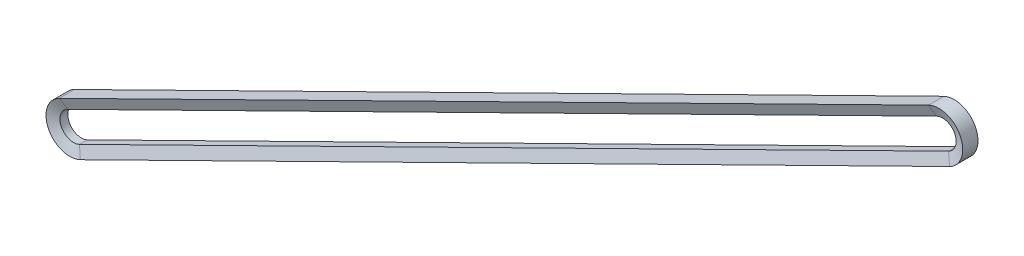
ISO-10303-21;
HEADER;
FILE_DESCRIPTION(('STEP AP214'),'2;1');
FILE_NAME('part.step','',(''),(''),'','','');
FILE_SCHEMA(('AUTOMOTIVE_DESIGN { 1 0 10303 214 1 1 1 1 }'));
ENDSEC;
DATA;
#1=APPLICATION_CONTEXT('core data for automotive mechanical design processes');
#2=APPLICATION_PROTOCOL_DEFINITION('international standard','automotive_design',2000,#1);
#3=PRODUCT_CONTEXT('',#1,'mechanical');
#4=PRODUCT('Part','Part','',(#3));
#5=PRODUCT_RELATED_PRODUCT_CATEGORY('part','',(#4));
#6=PRODUCT_DEFINITION_FORMATION('','',#4);
#7=PRODUCT_DEFINITION_CONTEXT('part definition',#1,'design');
#8=PRODUCT_DEFINITION('design','',#6,#7);
#9=PRODUCT_DEFINITION_SHAPE('','',#8);
#10=(LENGTH_UNIT() NAMED_UNIT(*) SI_UNIT(.MILLI.,.METRE.));
#11=(NAMED_UNIT(*) PLANE_ANGLE_UNIT() SI_UNIT($,.RADIAN.));
#12=(NAMED_UNIT(*) SI_UNIT($,.STERADIAN.) SOLID_ANGLE_UNIT());
#13=UNCERTAINTY_MEASURE_WITH_UNIT(LENGTH_MEASURE(1.E-05),#10,'distance_accuracy_value','');
#14=(GEOMETRIC_REPRESENTATION_CONTEXT(3) GLOBAL_UNCERTAINTY_ASSIGNED_CONTEXT((#13)) GLOBAL_UNIT_ASSIGNED_CONTEXT((#10,
#11,#12)) REPRESENTATION_CONTEXT('',''));
#15=CARTESIAN_POINT('',(0.,0.,0.));
#16=DIRECTION('',(0.,0.,1.));
#17=DIRECTION('',(1.,0.,0.));
#18=AXIS2_PLACEMENT_3D('',#15,#16,#17);
#19=CARTESIAN_POINT('',(-2.22044604925031E-13,-3.33066907387547E-13,0.));
#20=DIRECTION('',(0.,0.,1.));
#21=DIRECTION('',(1.,0.,0.));
#22=AXIS2_PLACEMENT_3D('',#19,#20,#21);
#23=CYLINDRICAL_SURFACE('',#22,5.29999999999982);
#24=CARTESIAN_POINT('',(-2.22044604925031E-13,-3.33066907387547E-13,-1.535));
#25=DIRECTION('',(0.,0.,1.));
#26=DIRECTION('',(0.442324592711042,-0.896855035489577,0.));
#27=AXIS2_PLACEMENT_3D('',#24,#25,#26);
#28=CIRCLE('',#27,5.29999999999982);
#29=CARTESIAN_POINT('',(2.34432034136839,-4.75333168809533,-1.535));
#30=VERTEX_POINT('',#29);
#31=CARTESIAN_POINT('',(-2.34432034136822,4.75333168809494,-1.535));
#32=VERTEX_POINT('',#31);
#33=EDGE_CURVE('E11',#30,#32,#28,.T.);
#34=ORIENTED_EDGE('',*,*,#33,.F.);
#35=DIRECTION('',(0.,0.,-1.));
#36=VECTOR('',#35,1.);
#37=CARTESIAN_POINT('',(2.34432034136822,-4.75333168809494,1.535));
#38=LINE('',#37,#36);
#39=CARTESIAN_POINT('',(2.34432034136839,-4.75333168809533,1.535));
#40=VERTEX_POINT('',#39);
#41=EDGE_CURVE('E42',#30,#40,#38,.F.);
#42=ORIENTED_EDGE('',*,*,#41,.T.);
#43=CARTESIAN_POINT('',(-2.22044604925031E-13,-3.33066907387547E-13,1.535));
#44=DIRECTION('',(0.,0.,1.));
#45=DIRECTION('',(0.442324592711042,-0.896855035489577,0.));
#46=AXIS2_PLACEMENT_3D('',#43,#44,#45);
#47=CIRCLE('',#46,5.29999999999982);
#48=CARTESIAN_POINT('',(-2.34432034136822,4.75333168809494,1.535));
#49=VERTEX_POINT('',#48);
#50=EDGE_CURVE('E127',#40,#49,#47,.T.);
#51=ORIENTED_EDGE('',*,*,#50,.T.);
#52=DIRECTION('',(0.,0.,-1.));
#53=VECTOR('',#52,1.);
#54=CARTESIAN_POINT('',(-2.34432034136822,4.75333168809494,1.535));
#55=LINE('',#54,#53);
#56=EDGE_CURVE('E130',#32,#49,#55,.F.);
#57=ORIENTED_EDGE('',*,*,#56,.F.);
#58=EDGE_LOOP('',(#34,#42,#51,#57));
#59=FACE_BOUND('',#58,.T.);
#60=ADVANCED_FACE('F39',(#59),#23,.F.);
#61=CARTESIAN_POINT('',(-2.22044604925031E-13,-3.33066907387547E-13,-2.99088093706479));
#62=DIRECTION('',(0.,0.,-1.));
#63=DIRECTION('',(-1.,0.,0.));
#64=AXIS2_PLACEMENT_3D('',#61,#62,#63);
#65=CONICAL_SURFACE('',#64,9.29999999999982,1.22173047639603);
#66=CARTESIAN_POINT('',(-2.22044604925031E-13,-3.33066907387547E-13,-2.99088093706479));
#67=DIRECTION('',(0.,0.,1.));
#68=DIRECTION('',(0.442324592711016,-0.89685503548959,0.));
#69=AXIS2_PLACEMENT_3D('',#66,#67,#68);
#70=CIRCLE('',#69,9.29999999999982);
#71=CARTESIAN_POINT('',(4.11361871221233,-8.34075183005375,-2.99088093706479));
#72=VERTEX_POINT('',#71);
#73=CARTESIAN_POINT('',(-4.11361871221215,8.34075183005336,-2.99088093706479));
#74=VERTEX_POINT('',#73);
#75=EDGE_CURVE('E47',#72,#74,#70,.T.);
#76=ORIENTED_EDGE('',*,*,#75,.F.);
#77=DIRECTION('',(0.415649155762644,-0.842768058764268,-0.342020143325666));
#78=VECTOR('',#77,1.);
#79=CARTESIAN_POINT('',(2.34432034136822,-4.75333168809494,-1.535));
#80=LINE('',#79,#78);
#81=EDGE_CURVE('E197',#72,#30,#80,.F.);
#82=ORIENTED_EDGE('',*,*,#81,.T.);
#83=ORIENTED_EDGE('',*,*,#33,.T.);
#84=DIRECTION('',(-0.415649155762644,0.842768058764268,-0.342020143325666));
#85=VECTOR('',#84,1.);
#86=CARTESIAN_POINT('',(-2.34432034136822,4.75333168809494,-1.535));
#87=LINE('',#86,#85);
#88=EDGE_CURVE('E155',#74,#32,#87,.F.);
#89=ORIENTED_EDGE('',*,*,#88,.F.);
#90=EDGE_LOOP('',(#76,#82,#83,#89));
#91=FACE_BOUND('',#90,.T.);
#92=ADVANCED_FACE('F221',(#91),#65,.F.);
#93=CARTESIAN_POINT('',(-2.22044604925031E-13,-3.33066907387547E-13,0.));
#94=DIRECTION('',(0.,0.,1.));
#95=DIRECTION('',(1.,0.,0.));
#96=AXIS2_PLACEMENT_3D('',#93,#94,#95);
#97=CYLINDRICAL_SURFACE('',#96,9.29999999999982);
#98=CARTESIAN_POINT('',(-2.22044604925031E-13,-3.33066907387547E-13,2.99088093706479));
#99=DIRECTION('',(0.,0.,1.));
#100=DIRECTION('',(0.442324592711016,-0.89685503548959,0.));
#101=AXIS2_PLACEMENT_3D('',#98,#99,#100);
#102=CIRCLE('',#101,9.29999999999982);
#103=CARTESIAN_POINT('',(4.11361871221233,-8.34075183005375,2.99088093706479));
#104=VERTEX_POINT('',#103);
#105=CARTESIAN_POINT('',(-4.11361871221215,8.34075183005336,2.99088093706479));
#106=VERTEX_POINT('',#105);
#107=EDGE_CURVE('E136',#104,#106,#102,.T.);
#108=ORIENTED_EDGE('',*,*,#107,.F.);
#109=DIRECTION('',(0.,0.,-1.));
#110=VECTOR('',#109,1.);
#111=CARTESIAN_POINT('',(4.11361871221215,-8.34075183005336,2.99088093706479));
#112=LINE('',#111,#110);
#113=EDGE_CURVE('E181',#104,#72,#112,.T.);
#114=ORIENTED_EDGE('',*,*,#113,.T.);
#115=ORIENTED_EDGE('',*,*,#75,.T.);
#116=DIRECTION('',(0.,0.,-1.));
#117=VECTOR('',#116,1.);
#118=CARTESIAN_POINT('',(-4.11361871221215,8.34075183005336,2.99088093706479));
#119=LINE('',#118,#117);
#120=EDGE_CURVE('E159',#106,#74,#119,.T.);
#121=ORIENTED_EDGE('',*,*,#120,.F.);
#122=EDGE_LOOP('',(#108,#114,#115,#121));
#123=FACE_BOUND('',#122,.T.);
#124=ADVANCED_FACE('F226',(#123),#97,.T.);
#125=CARTESIAN_POINT('',(-337.429166382249,-172.327982196657,1.535));
#126=DIRECTION('',(-0.442324592710983,0.896855035489606,0.));
#127=DIRECTION('',(-0.896855035489607,-0.442324592710983,0.));
#128=AXIS2_PLACEMENT_3D('',#125,#126,#127);
#129=PLANE('',#128);
#130=ORIENTED_EDGE('',*,*,#41,.F.);
#131=DIRECTION('',(0.896855035489606,0.442324592710983,0.));
#132=VECTOR('',#131,1.);
#133=CARTESIAN_POINT('',(-337.429166382249,-172.327982196657,-1.535));
#134=LINE('',#133,#132);
#135=CARTESIAN_POINT('',(-337.429166382249,-172.327982196657,-1.535));
#136=VERTEX_POINT('',#135);
#137=EDGE_CURVE('E83',#136,#30,#134,.T.);
#138=ORIENTED_EDGE('',*,*,#137,.F.);
#139=DIRECTION('',(0.,0.,-1.));
#140=VECTOR('',#139,1.);
#141=CARTESIAN_POINT('',(-337.429166382249,-172.327982196657,1.535));
#142=LINE('',#141,#140);
#143=CARTESIAN_POINT('',(-337.429166382249,-172.327982196657,1.535));
#144=VERTEX_POINT('',#143);
#145=EDGE_CURVE('E184',#136,#144,#142,.F.);
#146=ORIENTED_EDGE('',*,*,#145,.T.);
#147=DIRECTION('',(0.896855035489606,0.442324592710983,0.));
#148=VECTOR('',#147,1.);
#149=CARTESIAN_POINT('',(-337.429166382249,-172.327982196657,1.535));
#150=LINE('',#149,#148);
#151=EDGE_CURVE('E179',#144,#40,#150,.T.);
#152=ORIENTED_EDGE('',*,*,#151,.T.);
#153=EDGE_LOOP('',(#130,#138,#146,#152));
#154=FACE_BOUND('',#153,.T.);
#155=ADVANCED_FACE('F210',(#154),#129,.T.);
#156=CARTESIAN_POINT('',(-337.429166382249,-172.327982196657,-1.535));
#157=DIRECTION('',(-0.151283920595477,0.3067424877805,-0.93969262078591));
#158=DIRECTION('',(0.,0.950634084780424,0.310314093868916));
#159=AXIS2_PLACEMENT_3D('',#156,#157,#158);
#160=PLANE('',#159);
#161=ORIENTED_EDGE('',*,*,#137,.T.);
#162=ORIENTED_EDGE('',*,*,#81,.F.);
#163=DIRECTION('',(0.896855035489606,0.442324592710983,0.));
#164=VECTOR('',#163,1.);
#165=CARTESIAN_POINT('',(-335.659868011405,-175.915402338615,-2.99088093706479));
#166=LINE('',#165,#164);
#167=CARTESIAN_POINT('',(-335.659868011405,-175.915402338615,-2.99088093706479));
#168=VERTEX_POINT('',#167);
#169=EDGE_CURVE('E92',#168,#72,#166,.T.);
#170=ORIENTED_EDGE('',*,*,#169,.F.);
#171=DIRECTION('',(0.415649155762645,-0.842768058764267,-0.342020143325666));
#172=VECTOR('',#171,1.);
#173=CARTESIAN_POINT('',(-337.429166382249,-172.327982196657,-1.535));
#174=LINE('',#173,#172);
#175=EDGE_CURVE('E193',#168,#136,#174,.F.);
#176=ORIENTED_EDGE('',*,*,#175,.T.);
#177=EDGE_LOOP('',(#161,#162,#170,#176));
#178=FACE_BOUND('',#177,.T.);
#179=ADVANCED_FACE('F220',(#178),#160,.T.);
#180=CARTESIAN_POINT('',(-335.659868011405,-175.915402338615,2.99088093706479));
#181=DIRECTION('',(0.442324592710983,-0.896855035489606,0.));
#182=DIRECTION('',(0.896855035489607,0.442324592710983,0.));
#183=AXIS2_PLACEMENT_3D('',#180,#181,#182);
#184=PLANE('',#183);
#185=ORIENTED_EDGE('',*,*,#169,.T.);
#186=ORIENTED_EDGE('',*,*,#113,.F.);
#187=DIRECTION('',(0.896855035489606,0.442324592710983,0.));
#188=VECTOR('',#187,1.);
#189=CARTESIAN_POINT('',(-335.659868011405,-175.915402338615,2.99088093706479));
#190=LINE('',#189,#188);
#191=CARTESIAN_POINT('',(-335.659868011405,-175.915402338615,2.99088093706479));
#192=VERTEX_POINT('',#191);
#193=EDGE_CURVE('E100',#192,#104,#190,.T.);
#194=ORIENTED_EDGE('',*,*,#193,.F.);
#195=DIRECTION('',(0.,0.,-1.));
#196=VECTOR('',#195,1.);
#197=CARTESIAN_POINT('',(-335.659868011405,-175.915402338615,2.99088093706479));
#198=LINE('',#197,#196);
#199=EDGE_CURVE('E173',#192,#168,#198,.T.);
#200=ORIENTED_EDGE('',*,*,#199,.T.);
#201=EDGE_LOOP('',(#185,#186,#194,#200));
#202=FACE_BOUND('',#201,.T.);
#203=ADVANCED_FACE('F227',(#202),#184,.T.);
#204=CARTESIAN_POINT('',(-337.429166382249,-172.327982196657,1.535));
#205=DIRECTION('',(-0.151283920595477,0.3067424877805,0.93969262078591));
#206=DIRECTION('',(0.,-0.950634084780424,0.310314093868916));
#207=AXIS2_PLACEMENT_3D('',#204,#205,#206);
#208=PLANE('',#207);
#209=ORIENTED_EDGE('',*,*,#193,.T.);
#210=DIRECTION('',(0.415649155762644,-0.842768058764268,0.342020143325666));
#211=VECTOR('',#210,1.);
#212=CARTESIAN_POINT('',(2.34432034136822,-4.75333168809494,1.535));
#213=LINE('',#212,#211);
#214=EDGE_CURVE('E177',#40,#104,#213,.T.);
#215=ORIENTED_EDGE('',*,*,#214,.F.);
#216=ORIENTED_EDGE('',*,*,#151,.F.);
#217=DIRECTION('',(0.415649155762645,-0.842768058764267,0.342020143325666));
#218=VECTOR('',#217,1.);
#219=CARTESIAN_POINT('',(-337.429166382249,-172.327982196657,1.535));
#220=LINE('',#219,#218);
#221=EDGE_CURVE('E168',#144,#192,#220,.T.);
#222=ORIENTED_EDGE('',*,*,#221,.T.);
#223=EDGE_LOOP('',(#209,#215,#216,#222));
#224=FACE_BOUND('',#223,.T.);
#225=ADVANCED_FACE('F228',(#224),#208,.T.);
#226=CARTESIAN_POINT('',(-339.773486723617,-167.574650508562,0.));
#227=DIRECTION('',(0.,0.,1.));
#228=DIRECTION('',(1.,0.,0.));
#229=AXIS2_PLACEMENT_3D('',#226,#227,#228);
#230=CYLINDRICAL_SURFACE('',#229,5.30000000000023);
#231=ORIENTED_EDGE('',*,*,#145,.F.);
#232=CARTESIAN_POINT('',(-339.773486723617,-167.574650508562,-1.535));
#233=DIRECTION('',(0.,0.,1.));
#234=DIRECTION('',(-0.442324592710914,0.896855035489641,0.));
#235=AXIS2_PLACEMENT_3D('',#232,#233,#234);
#236=CIRCLE('',#235,5.30000000000023);
#237=CARTESIAN_POINT('',(-342.117807064985,-162.821318820466,-1.535));
#238=VERTEX_POINT('',#237);
#239=EDGE_CURVE('E203',#238,#136,#236,.T.);
#240=ORIENTED_EDGE('',*,*,#239,.F.);
#241=DIRECTION('',(0.,0.,-1.));
#242=VECTOR('',#241,1.);
#243=CARTESIAN_POINT('',(-342.117807064985,-162.821318820466,1.535));
#244=LINE('',#243,#242);
#245=CARTESIAN_POINT('',(-342.117807064985,-162.821318820466,1.535));
#246=VERTEX_POINT('',#245);
#247=EDGE_CURVE('E176',#238,#246,#244,.F.);
#248=ORIENTED_EDGE('',*,*,#247,.T.);
#249=CARTESIAN_POINT('',(-339.773486723617,-167.574650508562,1.535));
#250=DIRECTION('',(0.,0.,1.));
#251=DIRECTION('',(-0.442324592710914,0.896855035489641,0.));
#252=AXIS2_PLACEMENT_3D('',#249,#250,#251);
#253=CIRCLE('',#252,5.30000000000023);
#254=EDGE_CURVE('E171',#246,#144,#253,.T.);
#255=ORIENTED_EDGE('',*,*,#254,.T.);
#256=EDGE_LOOP('',(#231,#240,#248,#255));
#257=FACE_BOUND('',#256,.T.);
#258=ADVANCED_FACE('F215',(#257),#230,.F.);
#259=CARTESIAN_POINT('',(-339.773486723617,-167.574650508562,-2.99088093706479));
#260=DIRECTION('',(0.,0.,-1.));
#261=DIRECTION('',(-1.,0.,0.));
#262=AXIS2_PLACEMENT_3D('',#259,#260,#261);
#263=CONICAL_SURFACE('',#262,9.30000000000024,1.22173047639603);
#264=ORIENTED_EDGE('',*,*,#239,.T.);
#265=ORIENTED_EDGE('',*,*,#175,.F.);
#266=CARTESIAN_POINT('',(-339.773486723617,-167.574650508562,-2.99088093706479));
#267=DIRECTION('',(0.,0.,1.));
#268=DIRECTION('',(-0.442324592710944,0.896855035489625,0.));
#269=AXIS2_PLACEMENT_3D('',#266,#267,#268);
#270=CIRCLE('',#269,9.30000000000024);
#271=CARTESIAN_POINT('',(-343.887105435828,-159.233898678508,-2.99088093706479));
#272=VERTEX_POINT('',#271);
#273=EDGE_CURVE('E112',#272,#168,#270,.T.);
#274=ORIENTED_EDGE('',*,*,#273,.F.);
#275=DIRECTION('',(-0.415649155762644,0.842768058764268,-0.342020143325666));
#276=VECTOR('',#275,1.);
#277=CARTESIAN_POINT('',(-342.117807064985,-162.821318820466,-1.535));
#278=LINE('',#277,#276);
#279=EDGE_CURVE('E190',#272,#238,#278,.F.);
#280=ORIENTED_EDGE('',*,*,#279,.T.);
#281=EDGE_LOOP('',(#264,#265,#274,#280));
#282=FACE_BOUND('',#281,.T.);
#283=ADVANCED_FACE('F219',(#282),#263,.F.);
#284=CARTESIAN_POINT('',(-339.773486723617,-167.574650508562,0.));
#285=DIRECTION('',(0.,0.,1.));
#286=DIRECTION('',(1.,0.,0.));
#287=AXIS2_PLACEMENT_3D('',#284,#285,#286);
#288=CYLINDRICAL_SURFACE('',#287,9.30000000000024);
#289=ORIENTED_EDGE('',*,*,#273,.T.);
#290=ORIENTED_EDGE('',*,*,#199,.F.);
#291=CARTESIAN_POINT('',(-339.773486723617,-167.574650508562,2.99088093706479));
#292=DIRECTION('',(0.,0.,1.));
#293=DIRECTION('',(-0.442324592710944,0.896855035489625,0.));
#294=AXIS2_PLACEMENT_3D('',#291,#292,#293);
#295=CIRCLE('',#294,9.30000000000024);
#296=CARTESIAN_POINT('',(-343.887105435828,-159.233898678508,2.99088093706479));
#297=VERTEX_POINT('',#296);
#298=EDGE_CURVE('E118',#297,#192,#295,.T.);
#299=ORIENTED_EDGE('',*,*,#298,.F.);
#300=DIRECTION('',(0.,0.,-1.));
#301=VECTOR('',#300,1.);
#302=CARTESIAN_POINT('',(-343.887105435829,-159.233898678508,2.99088093706479));
#303=LINE('',#302,#301);
#304=EDGE_CURVE('E166',#297,#272,#303,.T.);
#305=ORIENTED_EDGE('',*,*,#304,.T.);
#306=EDGE_LOOP('',(#289,#290,#299,#305));
#307=FACE_BOUND('',#306,.T.);
#308=ADVANCED_FACE('F284',(#307),#288,.T.);
#309=CARTESIAN_POINT('',(-339.773486723617,-167.574650508562,1.535));
#310=DIRECTION('',(0.,0.,1.));
#311=DIRECTION('',(1.,0.,0.));
#312=AXIS2_PLACEMENT_3D('',#309,#310,#311);
#313=CONICAL_SURFACE('',#312,5.30000000000023,1.22173047639603);
#314=ORIENTED_EDGE('',*,*,#298,.T.);
#315=ORIENTED_EDGE('',*,*,#221,.F.);
#316=ORIENTED_EDGE('',*,*,#254,.F.);
#317=DIRECTION('',(-0.415649155762644,0.842768058764268,0.342020143325666));
#318=VECTOR('',#317,1.);
#319=CARTESIAN_POINT('',(-342.117807064985,-162.821318820466,1.535));
#320=LINE('',#319,#318);
#321=EDGE_CURVE('E147',#246,#297,#320,.T.);
#322=ORIENTED_EDGE('',*,*,#321,.T.);
#323=EDGE_LOOP('',(#314,#315,#316,#322));
#324=FACE_BOUND('',#323,.T.);
#325=ADVANCED_FACE('F213',(#324),#313,.F.);
#326=CARTESIAN_POINT('',(-2.34432034136822,4.75333168809494,1.535));
#327=DIRECTION('',(0.442324592710983,-0.896855035489606,0.));
#328=DIRECTION('',(0.896855035489607,0.442324592710983,0.));
#329=AXIS2_PLACEMENT_3D('',#326,#327,#328);
#330=PLANE('',#329);
#331=ORIENTED_EDGE('',*,*,#247,.F.);
#332=DIRECTION('',(-0.896855035489606,-0.442324592710983,0.));
#333=VECTOR('',#332,1.);
#334=CARTESIAN_POINT('',(-2.34432034136822,4.75333168809494,-1.535));
#335=LINE('',#334,#333);
#336=EDGE_CURVE('E154',#32,#238,#335,.T.);
#337=ORIENTED_EDGE('',*,*,#336,.F.);
#338=ORIENTED_EDGE('',*,*,#56,.T.);
#339=DIRECTION('',(-0.896855035489606,-0.442324592710983,0.));
#340=VECTOR('',#339,1.);
#341=CARTESIAN_POINT('',(-2.34432034136822,4.75333168809494,1.535));
#342=LINE('',#341,#340);
#343=EDGE_CURVE('E142',#49,#246,#342,.T.);
#344=ORIENTED_EDGE('',*,*,#343,.T.);
#345=EDGE_LOOP('',(#331,#337,#338,#344));
#346=FACE_BOUND('',#345,.T.);
#347=ADVANCED_FACE('F152',(#346),#330,.T.);
#348=CARTESIAN_POINT('',(-2.34432034136822,4.75333168809494,-1.535));
#349=DIRECTION('',(0.151283920595477,-0.3067424877805,-0.93969262078591));
#350=DIRECTION('',(0.,0.950634084780424,-0.310314093868916));
#351=AXIS2_PLACEMENT_3D('',#348,#349,#350);
#352=PLANE('',#351);
#353=ORIENTED_EDGE('',*,*,#336,.T.);
#354=ORIENTED_EDGE('',*,*,#279,.F.);
#355=DIRECTION('',(-0.896855035489606,-0.442324592710983,0.));
#356=VECTOR('',#355,1.);
#357=CARTESIAN_POINT('',(-4.11361871221215,8.34075183005336,-2.99088093706479));
#358=LINE('',#357,#356);
#359=EDGE_CURVE('E187',#74,#272,#358,.T.);
#360=ORIENTED_EDGE('',*,*,#359,.F.);
#361=ORIENTED_EDGE('',*,*,#88,.T.);
#362=EDGE_LOOP('',(#353,#354,#360,#361));
#363=FACE_BOUND('',#362,.T.);
#364=ADVANCED_FACE('F217',(#363),#352,.T.);
#365=CARTESIAN_POINT('',(-4.11361871221215,8.34075183005336,2.99088093706479));
#366=DIRECTION('',(-0.442324592710983,0.896855035489606,0.));
#367=DIRECTION('',(-0.896855035489607,-0.442324592710983,0.));
#368=AXIS2_PLACEMENT_3D('',#365,#366,#367);
#369=PLANE('',#368);
#370=ORIENTED_EDGE('',*,*,#359,.T.);
#371=ORIENTED_EDGE('',*,*,#304,.F.);
#372=DIRECTION('',(-0.896855035489606,-0.442324592710983,0.));
#373=VECTOR('',#372,1.);
#374=CARTESIAN_POINT('',(-4.11361871221215,8.34075183005336,2.99088093706479));
#375=LINE('',#374,#373);
#376=EDGE_CURVE('E165',#106,#297,#375,.T.);
#377=ORIENTED_EDGE('',*,*,#376,.F.);
#378=ORIENTED_EDGE('',*,*,#120,.T.);
#379=EDGE_LOOP('',(#370,#371,#377,#378));
#380=FACE_BOUND('',#379,.T.);
#381=ADVANCED_FACE('F224',(#380),#369,.T.);
#382=CARTESIAN_POINT('',(-2.34432034136822,4.75333168809494,1.535));
#383=DIRECTION('',(0.151283920595477,-0.3067424877805,0.93969262078591));
#384=DIRECTION('',(0.,-0.950634084780424,-0.310314093868916));
#385=AXIS2_PLACEMENT_3D('',#382,#383,#384);
#386=PLANE('',#385);
#387=ORIENTED_EDGE('',*,*,#376,.T.);
#388=ORIENTED_EDGE('',*,*,#321,.F.);
#389=ORIENTED_EDGE('',*,*,#343,.F.);
#390=DIRECTION('',(-0.415649155762644,0.842768058764268,0.342020143325666));
#391=VECTOR('',#390,1.);
#392=CARTESIAN_POINT('',(-2.34432034136822,4.75333168809494,1.535));
#393=LINE('',#392,#391);
#394=EDGE_CURVE('E145',#49,#106,#393,.T.);
#395=ORIENTED_EDGE('',*,*,#394,.T.);
#396=EDGE_LOOP('',(#387,#388,#389,#395));
#397=FACE_BOUND('',#396,.T.);
#398=ADVANCED_FACE('F144',(#397),#386,.T.);
#399=CARTESIAN_POINT('',(-2.22044604925031E-13,-3.33066907387547E-13,1.535));
#400=DIRECTION('',(0.,0.,1.));
#401=DIRECTION('',(1.,0.,0.));
#402=AXIS2_PLACEMENT_3D('',#399,#400,#401);
#403=CONICAL_SURFACE('',#402,5.29999999999982,1.22173047639603);
#404=ORIENTED_EDGE('',*,*,#214,.T.);
#405=ORIENTED_EDGE('',*,*,#107,.T.);
#406=ORIENTED_EDGE('',*,*,#394,.F.);
#407=ORIENTED_EDGE('',*,*,#50,.F.);
#408=EDGE_LOOP('',(#404,#405,#406,#407));
#409=FACE_BOUND('',#408,.T.);
#410=ADVANCED_FACE('F157',(#409),#403,.F.);
#411=CLOSED_SHELL('',(#60,#92,#124,#155,#179,#203,#225,#258,#283,#308,#325,#347,#364,#381,#398,#410));
#412=MANIFOLD_SOLID_BREP('B2',#411);
#413=ADVANCED_BREP_SHAPE_REPRESENTATION('',(#18,#412),#14);
#414=SHAPE_DEFINITION_REPRESENTATION(#9,#413);
ENDSEC;
END-ISO-10303-21;
